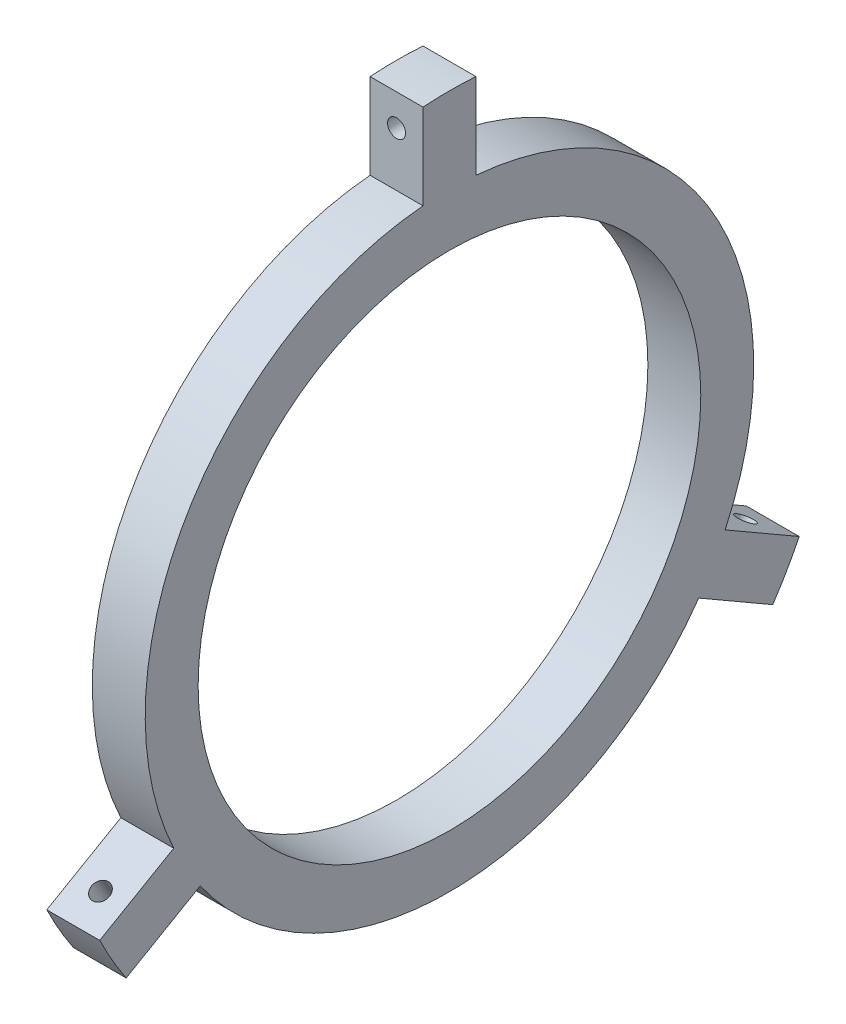
ISO-10303-21;
HEADER;
FILE_DESCRIPTION(('STEP AP214'),'2;1');
FILE_NAME('part.step','',(''),(''),'','','');
FILE_SCHEMA(('AUTOMOTIVE_DESIGN { 1 0 10303 214 1 1 1 1 }'));
ENDSEC;
DATA;
#1=APPLICATION_CONTEXT('core data for automotive mechanical design processes');
#2=APPLICATION_PROTOCOL_DEFINITION('international standard','automotive_design',2000,#1);
#3=PRODUCT_CONTEXT('',#1,'mechanical');
#4=PRODUCT('Part','Part','',(#3));
#5=PRODUCT_RELATED_PRODUCT_CATEGORY('part','',(#4));
#6=PRODUCT_DEFINITION_FORMATION('','',#4);
#7=PRODUCT_DEFINITION_CONTEXT('part definition',#1,'design');
#8=PRODUCT_DEFINITION('design','',#6,#7);
#9=PRODUCT_DEFINITION_SHAPE('','',#8);
#10=(LENGTH_UNIT() NAMED_UNIT(*) SI_UNIT(.MILLI.,.METRE.));
#11=(NAMED_UNIT(*) PLANE_ANGLE_UNIT() SI_UNIT($,.RADIAN.));
#12=(NAMED_UNIT(*) SI_UNIT($,.STERADIAN.) SOLID_ANGLE_UNIT());
#13=UNCERTAINTY_MEASURE_WITH_UNIT(LENGTH_MEASURE(1.E-05),#10,'distance_accuracy_value','');
#14=(GEOMETRIC_REPRESENTATION_CONTEXT(3) GLOBAL_UNCERTAINTY_ASSIGNED_CONTEXT((#13)) GLOBAL_UNIT_ASSIGNED_CONTEXT((#10,
#11,#12)) REPRESENTATION_CONTEXT('',''));
#15=CARTESIAN_POINT('',(0.,0.,0.));
#16=DIRECTION('',(0.,0.,1.));
#17=DIRECTION('',(1.,0.,0.));
#18=AXIS2_PLACEMENT_3D('',#15,#16,#17);
#19=CARTESIAN_POINT('',(-5.00000000000001,73.61,-5.));
#20=DIRECTION('',(-1.,0.,0.));
#21=DIRECTION('',(0.,0.,1.));
#22=AXIS2_PLACEMENT_3D('',#19,#20,#21);
#23=PLANE('',#22);
#24=CARTESIAN_POINT('',(-5.00000000000007,0.,0.));
#25=DIRECTION('',(1.,0.,0.));
#26=DIRECTION('',(0.,0.,-1.));
#27=AXIS2_PLACEMENT_3D('',#24,#25,#26);
#28=CIRCLE('',#27,47.5);
#29=CARTESIAN_POINT('',(-5.00000000000007,0.,-47.5));
#30=VERTEX_POINT('',#29);
#31=EDGE_CURVE('E278',#30,#30,#28,.T.);
#32=ORIENTED_EDGE('',*,*,#31,.T.);
#33=EDGE_LOOP('',(#32));
#34=FACE_BOUND('',#33,.T.);
#35=DIRECTION('',(0.,0.499999999999992,-0.866025403784443));
#36=VECTOR('',#35,1.);
#37=CARTESIAN_POINT('',(-5.00000000000001,-32.4748729810772,66.2481299725728));
#38=LINE('',#37,#36);
#39=CARTESIAN_POINT('',(-5.00000000000007,-32.3898678748677,66.1008968097152));
#40=VERTEX_POINT('',#39);
#41=CARTESIAN_POINT('',(-5.00000000000001,-24.3109710745513,52.1078370824613));
#42=VERTEX_POINT('',#41);
#43=EDGE_CURVE('E165',#40,#42,#38,.T.);
#44=ORIENTED_EDGE('',*,*,#43,.T.);
#45=CARTESIAN_POINT('',(-5.,0.,0.));
#46=DIRECTION('',(-1.,0.,0.));
#47=DIRECTION('',(0.,0.,1.));
#48=AXIS2_PLACEMENT_3D('',#45,#46,#47);
#49=CIRCLE('',#48,57.5);
#50=CARTESIAN_POINT('',(-5.,57.282196186948,5.));
#51=VERTEX_POINT('',#50);
#52=EDGE_CURVE('E127',#51,#42,#49,.F.);
#53=ORIENTED_EDGE('',*,*,#52,.F.);
#54=DIRECTION('',(0.,-1.,0.));
#55=VECTOR('',#54,1.);
#56=CARTESIAN_POINT('',(-5.00000000000001,73.61,5.));
#57=LINE('',#56,#55);
#58=CARTESIAN_POINT('',(-5.00000000000001,73.439989787581,5.));
#59=VERTEX_POINT('',#58);
#60=EDGE_CURVE('E139',#59,#51,#57,.T.);
#61=ORIENTED_EDGE('',*,*,#60,.F.);
#62=CARTESIAN_POINT('',(-5.00000000000001,0.,0.));
#63=DIRECTION('',(-1.,0.,0.));
#64=DIRECTION('',(0.,-1.,0.));
#65=AXIS2_PLACEMENT_3D('',#62,#63,#64);
#66=CIRCLE('',#65,73.61);
#67=CARTESIAN_POINT('',(-5.00000000000003,73.439989787581,-5.));
#68=VERTEX_POINT('',#67);
#69=EDGE_CURVE('E216',#59,#68,#66,.T.);
#70=ORIENTED_EDGE('',*,*,#69,.T.);
#71=DIRECTION('',(0.,-1.,0.));
#72=VECTOR('',#71,1.);
#73=CARTESIAN_POINT('',(-5.00000000000001,73.61,-5.));
#74=LINE('',#73,#72);
#75=CARTESIAN_POINT('',(-5.00000000000001,57.282196186948,-5.));
#76=VERTEX_POINT('',#75);
#77=EDGE_CURVE('E147',#68,#76,#74,.T.);
#78=ORIENTED_EDGE('',*,*,#77,.T.);
#79=CARTESIAN_POINT('',(-5.,-24.3109710745521,-52.107837082461));
#80=VERTEX_POINT('',#79);
#81=EDGE_CURVE('E224',#80,#76,#49,.F.);
#82=ORIENTED_EDGE('',*,*,#81,.F.);
#83=DIRECTION('',(0.,0.500000000000004,0.866025403784436));
#84=VECTOR('',#83,1.);
#85=CARTESIAN_POINT('',(-5.00000000000001,-32.4748729810781,-66.2481299725724));
#86=LINE('',#85,#84);
#87=CARTESIAN_POINT('',(-5.00000000000006,-32.3898678748686,-66.1008968097147));
#88=VERTEX_POINT('',#87);
#89=EDGE_CURVE('E201',#88,#80,#86,.T.);
#90=ORIENTED_EDGE('',*,*,#89,.F.);
#91=CARTESIAN_POINT('',(-5.00000000000005,0.,0.));
#92=DIRECTION('',(-1.,0.,0.));
#93=DIRECTION('',(0.,0.500000000000004,0.866025403784436));
#94=AXIS2_PLACEMENT_3D('',#91,#92,#93);
#95=CIRCLE('',#94,73.61);
#96=CARTESIAN_POINT('',(-5.00000000000006,-41.050121912713,-61.1008968097147));
#97=VERTEX_POINT('',#96);
#98=EDGE_CURVE('E188',#88,#97,#95,.T.);
#99=ORIENTED_EDGE('',*,*,#98,.T.);
#100=DIRECTION('',(0.,0.500000000000004,0.866025403784436));
#101=VECTOR('',#100,1.);
#102=CARTESIAN_POINT('',(-5.00000000000001,-41.1351270189225,-61.2481299725724));
#103=LINE('',#102,#101);
#104=CARTESIAN_POINT('',(-5.00000000000001,-32.9712251123964,-47.1078370824609));
#105=VERTEX_POINT('',#104);
#106=EDGE_CURVE('E205',#97,#105,#103,.T.);
#107=ORIENTED_EDGE('',*,*,#106,.T.);
#108=CARTESIAN_POINT('',(-5.,-32.9712251123958,47.1078370824614));
#109=VERTEX_POINT('',#108);
#110=EDGE_CURVE('E226',#109,#105,#49,.F.);
#111=ORIENTED_EDGE('',*,*,#110,.F.);
#112=DIRECTION('',(0.,0.499999999999992,-0.866025403784443));
#113=VECTOR('',#112,1.);
#114=CARTESIAN_POINT('',(-5.00000000000001,-41.1351270189216,61.2481299725729));
#115=LINE('',#114,#113);
#116=CARTESIAN_POINT('',(-5.00000000000007,-41.0501219127121,61.1008968097153));
#117=VERTEX_POINT('',#116);
#118=EDGE_CURVE('E178',#117,#109,#115,.T.);
#119=ORIENTED_EDGE('',*,*,#118,.F.);
#120=CARTESIAN_POINT('',(-5.00000000000005,0.,0.));
#121=DIRECTION('',(-1.,0.,0.));
#122=DIRECTION('',(0.,0.499999999999992,-0.866025403784443));
#123=AXIS2_PLACEMENT_3D('',#120,#121,#122);
#124=CIRCLE('',#123,73.61);
#125=EDGE_CURVE('E171',#117,#40,#124,.T.);
#126=ORIENTED_EDGE('',*,*,#125,.T.);
#127=EDGE_LOOP('',(#44,#53,#61,#70,#78,#82,#90,#99,#107,#111,#119,#126));
#128=FACE_BOUND('',#127,.T.);
#129=ADVANCED_FACE('F33',(#34,#128),#23,.T.);
#130=CARTESIAN_POINT('',(5.00000000000001,0.,-5.));
#131=DIRECTION('',(1.,0.,0.));
#132=DIRECTION('',(0.,0.,-1.));
#133=AXIS2_PLACEMENT_3D('',#130,#131,#132);
#134=PLANE('',#133);
#135=CARTESIAN_POINT('',(5.00000000000001,0.,0.));
#136=DIRECTION('',(1.,0.,0.));
#137=DIRECTION('',(0.,0.,-1.));
#138=AXIS2_PLACEMENT_3D('',#135,#136,#137);
#139=CIRCLE('',#138,47.5);
#140=CARTESIAN_POINT('',(5.00000000000001,0.,-47.5));
#141=VERTEX_POINT('',#140);
#142=EDGE_CURVE('E280',#141,#141,#139,.T.);
#143=ORIENTED_EDGE('',*,*,#142,.F.);
#144=EDGE_LOOP('',(#143));
#145=FACE_BOUND('',#144,.T.);
#146=DIRECTION('',(0.,-0.500000000000004,-0.866025403784436));
#147=VECTOR('',#146,1.);
#148=CARTESIAN_POINT('',(5.00000000000001,4.33012701892218,-2.50000000000002));
#149=LINE('',#148,#147);
#150=CARTESIAN_POINT('',(5.00000000000001,-24.3109710745521,-52.107837082461));
#151=VERTEX_POINT('',#150);
#152=CARTESIAN_POINT('',(4.99999999999999,-32.3898678748686,-66.1008968097147));
#153=VERTEX_POINT('',#152);
#154=EDGE_CURVE('E203',#151,#153,#149,.T.);
#155=ORIENTED_EDGE('',*,*,#154,.F.);
#156=CARTESIAN_POINT('',(5.00000000000001,0.,0.));
#157=DIRECTION('',(1.,0.,0.));
#158=DIRECTION('',(0.,0.,-1.));
#159=AXIS2_PLACEMENT_3D('',#156,#157,#158);
#160=CIRCLE('',#159,57.5);
#161=CARTESIAN_POINT('',(5.00000000000001,57.282196186948,-5.));
#162=VERTEX_POINT('',#161);
#163=EDGE_CURVE('E130',#151,#162,#160,.T.);
#164=ORIENTED_EDGE('',*,*,#163,.T.);
#165=DIRECTION('',(0.,1.,0.));
#166=VECTOR('',#165,1.);
#167=CARTESIAN_POINT('',(5.00000000000001,0.,-5.));
#168=LINE('',#167,#166);
#169=CARTESIAN_POINT('',(4.99999999999999,73.439989787581,-5.));
#170=VERTEX_POINT('',#169);
#171=EDGE_CURVE('E52',#162,#170,#168,.T.);
#172=ORIENTED_EDGE('',*,*,#171,.T.);
#173=CARTESIAN_POINT('',(5.00000000000001,0.,0.));
#174=DIRECTION('',(-1.,0.,0.));
#175=DIRECTION('',(0.,-1.,0.));
#176=AXIS2_PLACEMENT_3D('',#173,#174,#175);
#177=CIRCLE('',#176,73.61);
#178=CARTESIAN_POINT('',(4.99999999999999,73.439989787581,5.));
#179=VERTEX_POINT('',#178);
#180=EDGE_CURVE('E145',#179,#170,#177,.T.);
#181=ORIENTED_EDGE('',*,*,#180,.F.);
#182=DIRECTION('',(0.,1.,0.));
#183=VECTOR('',#182,1.);
#184=CARTESIAN_POINT('',(5.00000000000001,0.,5.));
#185=LINE('',#184,#183);
#186=CARTESIAN_POINT('',(5.00000000000001,57.282196186948,5.));
#187=VERTEX_POINT('',#186);
#188=EDGE_CURVE('E136',#187,#179,#185,.T.);
#189=ORIENTED_EDGE('',*,*,#188,.F.);
#190=CARTESIAN_POINT('',(5.00000000000001,-24.3109710745513,52.1078370824613));
#191=VERTEX_POINT('',#190);
#192=EDGE_CURVE('E119',#187,#191,#160,.T.);
#193=ORIENTED_EDGE('',*,*,#192,.T.);
#194=DIRECTION('',(0.,-0.499999999999992,0.866025403784443));
#195=VECTOR('',#194,1.);
#196=CARTESIAN_POINT('',(5.00000000000001,4.33012701892222,2.49999999999996));
#197=LINE('',#196,#195);
#198=CARTESIAN_POINT('',(5.00000000000001,-32.3898678748677,66.1008968097152));
#199=VERTEX_POINT('',#198);
#200=EDGE_CURVE('E163',#191,#199,#197,.T.);
#201=ORIENTED_EDGE('',*,*,#200,.T.);
#202=CARTESIAN_POINT('',(5.00000000000001,0.,0.));
#203=DIRECTION('',(-1.,0.,0.));
#204=DIRECTION('',(0.,0.499999999999992,-0.866025403784443));
#205=AXIS2_PLACEMENT_3D('',#202,#203,#204);
#206=CIRCLE('',#205,73.61);
#207=CARTESIAN_POINT('',(4.99999999999999,-41.0501219127121,61.1008968097153));
#208=VERTEX_POINT('',#207);
#209=EDGE_CURVE('E174',#208,#199,#206,.T.);
#210=ORIENTED_EDGE('',*,*,#209,.F.);
#211=DIRECTION('',(0.,-0.499999999999992,0.866025403784443));
#212=VECTOR('',#211,1.);
#213=CARTESIAN_POINT('',(5.00000000000001,-4.33012701892222,-2.49999999999996));
#214=LINE('',#213,#212);
#215=CARTESIAN_POINT('',(5.00000000000001,-32.9712251123958,47.1078370824614));
#216=VERTEX_POINT('',#215);
#217=EDGE_CURVE('E197',#216,#208,#214,.T.);
#218=ORIENTED_EDGE('',*,*,#217,.F.);
#219=CARTESIAN_POINT('',(5.00000000000001,-32.9712251123964,-47.107837082461));
#220=VERTEX_POINT('',#219);
#221=EDGE_CURVE('E128',#216,#220,#160,.T.);
#222=ORIENTED_EDGE('',*,*,#221,.T.);
#223=DIRECTION('',(0.,-0.500000000000004,-0.866025403784436));
#224=VECTOR('',#223,1.);
#225=CARTESIAN_POINT('',(5.00000000000001,-4.33012701892218,2.50000000000002));
#226=LINE('',#225,#224);
#227=CARTESIAN_POINT('',(5.00000000000001,-41.050121912713,-61.1008968097147));
#228=VERTEX_POINT('',#227);
#229=EDGE_CURVE('E208',#220,#228,#226,.T.);
#230=ORIENTED_EDGE('',*,*,#229,.T.);
#231=CARTESIAN_POINT('',(5.00000000000001,0.,0.));
#232=DIRECTION('',(-1.,0.,0.));
#233=DIRECTION('',(0.,0.500000000000004,0.866025403784436));
#234=AXIS2_PLACEMENT_3D('',#231,#232,#233);
#235=CIRCLE('',#234,73.61);
#236=EDGE_CURVE('E181',#153,#228,#235,.T.);
#237=ORIENTED_EDGE('',*,*,#236,.F.);
#238=EDGE_LOOP('',(#155,#164,#172,#181,#189,#193,#201,#210,#218,#222,#230,#237));
#239=FACE_BOUND('',#238,.T.);
#240=ADVANCED_FACE('F143',(#145,#239),#134,.T.);
#241=CARTESIAN_POINT('',(0.,0.,5.));
#242=DIRECTION('',(0.,0.,1.));
#243=DIRECTION('',(1.,0.,0.));
#244=AXIS2_PLACEMENT_3D('',#241,#242,#243);
#245=PLANE('',#244);
#246=DIRECTION('',(1.,0.,0.));
#247=VECTOR('',#246,1.);
#248=CARTESIAN_POINT('',(-167.634559672906,57.282196186948,5.));
#249=LINE('',#248,#247);
#250=EDGE_CURVE('E122',#187,#51,#249,.F.);
#251=ORIENTED_EDGE('',*,*,#250,.F.);
#252=ORIENTED_EDGE('',*,*,#188,.T.);
#253=DIRECTION('',(1.,0.,0.));
#254=VECTOR('',#253,1.);
#255=CARTESIAN_POINT('',(-5.00000000000003,73.439989787581,5.));
#256=LINE('',#255,#254);
#257=EDGE_CURVE('E155',#59,#179,#256,.T.);
#258=ORIENTED_EDGE('',*,*,#257,.F.);
#259=ORIENTED_EDGE('',*,*,#60,.T.);
#260=EDGE_LOOP('',(#251,#252,#258,#259));
#261=FACE_BOUND('',#260,.T.);
#262=CARTESIAN_POINT('',(0.,67.5,4.99999999999999));
#263=DIRECTION('',(0.,0.,-1.));
#264=DIRECTION('',(-1.,0.,0.));
#265=AXIS2_PLACEMENT_3D('',#262,#263,#264);
#266=CIRCLE('',#265,1.69999999999999);
#267=CARTESIAN_POINT('',(-1.70000000000001,67.5,4.99999999999999));
#268=VERTEX_POINT('',#267);
#269=EDGE_CURVE('E213',#268,#268,#266,.T.);
#270=ORIENTED_EDGE('',*,*,#269,.T.);
#271=EDGE_LOOP('',(#270));
#272=FACE_BOUND('',#271,.T.);
#273=ADVANCED_FACE('F133',(#261,#272),#245,.T.);
#274=CARTESIAN_POINT('',(0.,0.,-5.));
#275=DIRECTION('',(0.,0.,1.));
#276=DIRECTION('',(1.,0.,0.));
#277=AXIS2_PLACEMENT_3D('',#274,#275,#276);
#278=PLANE('',#277);
#279=CARTESIAN_POINT('',(0.,67.5,-5.));
#280=DIRECTION('',(0.,0.,-1.));
#281=DIRECTION('',(-1.,0.,0.));
#282=AXIS2_PLACEMENT_3D('',#279,#280,#281);
#283=CIRCLE('',#282,1.69999999999999);
#284=CARTESIAN_POINT('',(-1.70000000000001,67.5,-5.));
#285=VERTEX_POINT('',#284);
#286=EDGE_CURVE('E210',#285,#285,#283,.T.);
#287=ORIENTED_EDGE('',*,*,#286,.F.);
#288=EDGE_LOOP('',(#287));
#289=FACE_BOUND('',#288,.T.);
#290=ORIENTED_EDGE('',*,*,#171,.F.);
#291=DIRECTION('',(1.,0.,0.));
#292=VECTOR('',#291,1.);
#293=CARTESIAN_POINT('',(-167.634559672906,57.282196186948,-5.));
#294=LINE('',#293,#292);
#295=EDGE_CURVE('E47',#162,#76,#294,.F.);
#296=ORIENTED_EDGE('',*,*,#295,.T.);
#297=ORIENTED_EDGE('',*,*,#77,.F.);
#298=DIRECTION('',(1.,0.,0.));
#299=VECTOR('',#298,1.);
#300=CARTESIAN_POINT('',(-5.00000000000003,73.439989787581,-5.));
#301=LINE('',#300,#299);
#302=EDGE_CURVE('E150',#68,#170,#301,.T.);
#303=ORIENTED_EDGE('',*,*,#302,.T.);
#304=EDGE_LOOP('',(#290,#296,#297,#303));
#305=FACE_BOUND('',#304,.T.);
#306=ADVANCED_FACE('F219',(#289,#305),#278,.F.);
#307=CARTESIAN_POINT('',(-5.00000000000001,0.,0.));
#308=DIRECTION('',(1.,0.,0.));
#309=DIRECTION('',(0.,1.,0.));
#310=AXIS2_PLACEMENT_3D('',#307,#308,#309);
#311=CYLINDRICAL_SURFACE('',#310,73.61);
#312=ORIENTED_EDGE('',*,*,#180,.T.);
#313=ORIENTED_EDGE('',*,*,#302,.F.);
#314=ORIENTED_EDGE('',*,*,#69,.F.);
#315=ORIENTED_EDGE('',*,*,#257,.T.);
#316=EDGE_LOOP('',(#312,#313,#314,#315));
#317=FACE_BOUND('',#316,.T.);
#318=ADVANCED_FACE('F221',(#317),#311,.T.);
#319=CARTESIAN_POINT('',(0.,67.5,-5.));
#320=DIRECTION('',(0.,0.,-1.));
#321=DIRECTION('',(-1.,0.,0.));
#322=AXIS2_PLACEMENT_3D('',#319,#320,#321);
#323=CYLINDRICAL_SURFACE('',#322,1.69999999999999);
#324=ORIENTED_EDGE('',*,*,#269,.F.);
#325=EDGE_LOOP('',(#324));
#326=FACE_BOUND('',#325,.T.);
#327=ORIENTED_EDGE('',*,*,#286,.T.);
#328=EDGE_LOOP('',(#327));
#329=FACE_BOUND('',#328,.T.);
#330=ADVANCED_FACE('F257',(#326,#329),#323,.F.);
#331=CARTESIAN_POINT('',(0.,4.33012701892218,-2.50000000000002));
#332=DIRECTION('',(0.,0.866025403784436,-0.500000000000004));
#333=DIRECTION('',(1.,0.,0.));
#334=AXIS2_PLACEMENT_3D('',#331,#332,#333);
#335=PLANE('',#334);
#336=DIRECTION('',(1.,0.,0.));
#337=VECTOR('',#336,1.);
#338=CARTESIAN_POINT('',(-167.634559672906,-24.3109710745521,-52.107837082461));
#339=LINE('',#338,#337);
#340=EDGE_CURVE('E235',#151,#80,#339,.F.);
#341=ORIENTED_EDGE('',*,*,#340,.F.);
#342=ORIENTED_EDGE('',*,*,#154,.T.);
#343=DIRECTION('',(1.,0.,0.));
#344=VECTOR('',#343,1.);
#345=CARTESIAN_POINT('',(-5.00000000000006,-32.3898678748686,-66.1008968097147));
#346=LINE('',#345,#344);
#347=EDGE_CURVE('E191',#88,#153,#346,.T.);
#348=ORIENTED_EDGE('',*,*,#347,.F.);
#349=ORIENTED_EDGE('',*,*,#89,.T.);
#350=EDGE_LOOP('',(#341,#342,#348,#349));
#351=FACE_BOUND('',#350,.T.);
#352=CARTESIAN_POINT('',(0.,-29.4198729810781,-60.9567147554495));
#353=DIRECTION('',(0.,0.866025403784436,-0.500000000000004));
#354=DIRECTION('',(0.,0.500000000000004,0.866025403784436));
#355=AXIS2_PLACEMENT_3D('',#352,#353,#354);
#356=CIRCLE('',#355,1.69999999999999);
#357=CARTESIAN_POINT('',(0.,-28.5698729810781,-59.484471569016));
#358=VERTEX_POINT('',#357);
#359=EDGE_CURVE('E183',#358,#358,#356,.T.);
#360=ORIENTED_EDGE('',*,*,#359,.F.);
#361=EDGE_LOOP('',(#360));
#362=FACE_BOUND('',#361,.T.);
#363=ADVANCED_FACE('F254',(#351,#362),#335,.T.);
#364=CARTESIAN_POINT('',(0.,-4.33012701892218,2.50000000000002));
#365=DIRECTION('',(0.,0.866025403784436,-0.500000000000004));
#366=DIRECTION('',(1.,0.,0.));
#367=AXIS2_PLACEMENT_3D('',#364,#365,#366);
#368=PLANE('',#367);
#369=CARTESIAN_POINT('',(0.,-38.0801270189225,-55.9567147554494));
#370=DIRECTION('',(0.,-0.866025403784436,0.500000000000004));
#371=DIRECTION('',(0.,-0.500000000000004,-0.866025403784436));
#372=AXIS2_PLACEMENT_3D('',#369,#370,#371);
#373=CIRCLE('',#372,1.69999999999999);
#374=CARTESIAN_POINT('',(0.,-38.9301270189225,-57.428957941883));
#375=VERTEX_POINT('',#374);
#376=EDGE_CURVE('E245',#375,#375,#373,.T.);
#377=ORIENTED_EDGE('',*,*,#376,.F.);
#378=EDGE_LOOP('',(#377));
#379=FACE_BOUND('',#378,.T.);
#380=ORIENTED_EDGE('',*,*,#229,.F.);
#381=DIRECTION('',(1.,0.,0.));
#382=VECTOR('',#381,1.);
#383=CARTESIAN_POINT('',(-167.634559672906,-32.9712251123964,-47.1078370824609));
#384=LINE('',#383,#382);
#385=EDGE_CURVE('E233',#220,#105,#384,.F.);
#386=ORIENTED_EDGE('',*,*,#385,.T.);
#387=ORIENTED_EDGE('',*,*,#106,.F.);
#388=DIRECTION('',(1.,0.,0.));
#389=VECTOR('',#388,1.);
#390=CARTESIAN_POINT('',(-5.00000000000006,-41.050121912713,-61.1008968097147));
#391=LINE('',#390,#389);
#392=EDGE_CURVE('E157',#97,#228,#391,.T.);
#393=ORIENTED_EDGE('',*,*,#392,.T.);
#394=EDGE_LOOP('',(#380,#386,#387,#393));
#395=FACE_BOUND('',#394,.T.);
#396=ADVANCED_FACE('F256',(#379,#395),#368,.F.);
#397=CARTESIAN_POINT('',(0.,-4.33012701892222,-2.49999999999996));
#398=DIRECTION('',(0.,-0.866025403784443,-0.499999999999992));
#399=DIRECTION('',(1.,0.,0.));
#400=AXIS2_PLACEMENT_3D('',#397,#398,#399);
#401=PLANE('',#400);
#402=DIRECTION('',(1.,0.,0.));
#403=VECTOR('',#402,1.);
#404=CARTESIAN_POINT('',(-167.634559672906,-32.9712251123958,47.1078370824614));
#405=LINE('',#404,#403);
#406=EDGE_CURVE('E229',#216,#109,#405,.F.);
#407=ORIENTED_EDGE('',*,*,#406,.F.);
#408=ORIENTED_EDGE('',*,*,#217,.T.);
#409=DIRECTION('',(1.,0.,0.));
#410=VECTOR('',#409,1.);
#411=CARTESIAN_POINT('',(-5.00000000000007,-41.0501219127121,61.1008968097153));
#412=LINE('',#411,#410);
#413=EDGE_CURVE('E179',#117,#208,#412,.T.);
#414=ORIENTED_EDGE('',*,*,#413,.F.);
#415=ORIENTED_EDGE('',*,*,#118,.T.);
#416=EDGE_LOOP('',(#407,#408,#414,#415));
#417=FACE_BOUND('',#416,.T.);
#418=CARTESIAN_POINT('',(0.,-38.0801270189217,55.95671475545));
#419=DIRECTION('',(0.,-0.866025403784443,-0.499999999999992));
#420=DIRECTION('',(0.,0.499999999999992,-0.866025403784443));
#421=AXIS2_PLACEMENT_3D('',#418,#419,#420);
#422=CIRCLE('',#421,1.69999999999998);
#423=CARTESIAN_POINT('',(0.,-37.2301270189217,54.4844715690164));
#424=VERTEX_POINT('',#423);
#425=EDGE_CURVE('E243',#424,#424,#422,.T.);
#426=ORIENTED_EDGE('',*,*,#425,.F.);
#427=EDGE_LOOP('',(#426));
#428=FACE_BOUND('',#427,.T.);
#429=ADVANCED_FACE('F264',(#417,#428),#401,.T.);
#430=CARTESIAN_POINT('',(0.,4.33012701892222,2.49999999999996));
#431=DIRECTION('',(0.,-0.866025403784443,-0.499999999999992));
#432=DIRECTION('',(1.,0.,0.));
#433=AXIS2_PLACEMENT_3D('',#430,#431,#432);
#434=PLANE('',#433);
#435=CARTESIAN_POINT('',(0.,-29.4198729810772,60.9567147554499));
#436=DIRECTION('',(0.,0.866025403784443,0.499999999999992));
#437=DIRECTION('',(0.,-0.499999999999992,0.866025403784443));
#438=AXIS2_PLACEMENT_3D('',#435,#436,#437);
#439=CIRCLE('',#438,1.69999999999999);
#440=CARTESIAN_POINT('',(0.,-30.2698729810772,62.4289579418834));
#441=VERTEX_POINT('',#440);
#442=EDGE_CURVE('E140',#441,#441,#439,.T.);
#443=ORIENTED_EDGE('',*,*,#442,.F.);
#444=EDGE_LOOP('',(#443));
#445=FACE_BOUND('',#444,.T.);
#446=ORIENTED_EDGE('',*,*,#200,.F.);
#447=DIRECTION('',(1.,0.,0.));
#448=VECTOR('',#447,1.);
#449=CARTESIAN_POINT('',(-167.634559672906,-24.3109710745513,52.1078370824613));
#450=LINE('',#449,#448);
#451=EDGE_CURVE('E11',#191,#42,#450,.F.);
#452=ORIENTED_EDGE('',*,*,#451,.T.);
#453=ORIENTED_EDGE('',*,*,#43,.F.);
#454=DIRECTION('',(1.,0.,0.));
#455=VECTOR('',#454,1.);
#456=CARTESIAN_POINT('',(-5.00000000000007,-32.3898678748677,66.1008968097152));
#457=LINE('',#456,#455);
#458=EDGE_CURVE('E40',#40,#199,#457,.T.);
#459=ORIENTED_EDGE('',*,*,#458,.T.);
#460=EDGE_LOOP('',(#446,#452,#453,#459));
#461=FACE_BOUND('',#460,.T.);
#462=ADVANCED_FACE('F162',(#445,#461),#434,.F.);
#463=CARTESIAN_POINT('',(-5.00000000000005,0.,0.));
#464=DIRECTION('',(1.,0.,0.));
#465=DIRECTION('',(0.,0.,-1.));
#466=AXIS2_PLACEMENT_3D('',#463,#464,#465);
#467=CYLINDRICAL_SURFACE('',#466,73.61);
#468=ORIENTED_EDGE('',*,*,#236,.T.);
#469=ORIENTED_EDGE('',*,*,#392,.F.);
#470=ORIENTED_EDGE('',*,*,#98,.F.);
#471=ORIENTED_EDGE('',*,*,#347,.T.);
#472=EDGE_LOOP('',(#468,#469,#470,#471));
#473=FACE_BOUND('',#472,.T.);
#474=ADVANCED_FACE('F307',(#473),#467,.T.);
#475=CARTESIAN_POINT('',(-5.00000000000005,0.,0.));
#476=DIRECTION('',(1.,0.,0.));
#477=DIRECTION('',(0.,0.,-1.));
#478=AXIS2_PLACEMENT_3D('',#475,#476,#477);
#479=CYLINDRICAL_SURFACE('',#478,73.61);
#480=ORIENTED_EDGE('',*,*,#209,.T.);
#481=ORIENTED_EDGE('',*,*,#458,.F.);
#482=ORIENTED_EDGE('',*,*,#125,.F.);
#483=ORIENTED_EDGE('',*,*,#413,.T.);
#484=EDGE_LOOP('',(#480,#481,#482,#483));
#485=FACE_BOUND('',#484,.T.);
#486=ADVANCED_FACE('F169',(#485),#479,.T.);
#487=CARTESIAN_POINT('',(0.,-38.0801270189225,-55.9567147554494));
#488=DIRECTION('',(0.,-0.866025403784436,0.500000000000004));
#489=DIRECTION('',(0.,-0.500000000000004,-0.866025403784436));
#490=AXIS2_PLACEMENT_3D('',#487,#488,#489);
#491=CYLINDRICAL_SURFACE('',#490,1.69999999999999);
#492=ORIENTED_EDGE('',*,*,#359,.T.);
#493=EDGE_LOOP('',(#492));
#494=FACE_BOUND('',#493,.T.);
#495=ORIENTED_EDGE('',*,*,#376,.T.);
#496=EDGE_LOOP('',(#495));
#497=FACE_BOUND('',#496,.T.);
#498=ADVANCED_FACE('F252',(#494,#497),#491,.F.);
#499=CARTESIAN_POINT('',(0.,-29.4198729810772,60.9567147554499));
#500=DIRECTION('',(0.,0.866025403784443,0.499999999999992));
#501=DIRECTION('',(0.,-0.499999999999992,0.866025403784443));
#502=AXIS2_PLACEMENT_3D('',#499,#500,#501);
#503=CYLINDRICAL_SURFACE('',#502,1.69999999999998);
#504=ORIENTED_EDGE('',*,*,#425,.T.);
#505=EDGE_LOOP('',(#504));
#506=FACE_BOUND('',#505,.T.);
#507=ORIENTED_EDGE('',*,*,#442,.T.);
#508=EDGE_LOOP('',(#507));
#509=FACE_BOUND('',#508,.T.);
#510=ADVANCED_FACE('F299',(#506,#509),#503,.F.);
#511=CARTESIAN_POINT('',(-167.634559672906,0.,0.));
#512=DIRECTION('',(1.,0.,0.));
#513=DIRECTION('',(0.,0.,-1.));
#514=AXIS2_PLACEMENT_3D('',#511,#512,#513);
#515=CYLINDRICAL_SURFACE('',#514,57.5);
#516=ORIENTED_EDGE('',*,*,#192,.F.);
#517=ORIENTED_EDGE('',*,*,#250,.T.);
#518=ORIENTED_EDGE('',*,*,#52,.T.);
#519=ORIENTED_EDGE('',*,*,#451,.F.);
#520=EDGE_LOOP('',(#516,#517,#518,#519));
#521=FACE_BOUND('',#520,.T.);
#522=ADVANCED_FACE('F121',(#521),#515,.T.);
#523=ORIENTED_EDGE('',*,*,#385,.F.);
#524=ORIENTED_EDGE('',*,*,#221,.F.);
#525=ORIENTED_EDGE('',*,*,#406,.T.);
#526=ORIENTED_EDGE('',*,*,#110,.T.);
#527=EDGE_LOOP('',(#523,#524,#525,#526));
#528=FACE_BOUND('',#527,.T.);
#529=ADVANCED_FACE('F294',(#528),#515,.T.);
#530=ORIENTED_EDGE('',*,*,#295,.F.);
#531=ORIENTED_EDGE('',*,*,#163,.F.);
#532=ORIENTED_EDGE('',*,*,#340,.T.);
#533=ORIENTED_EDGE('',*,*,#81,.T.);
#534=EDGE_LOOP('',(#530,#531,#532,#533));
#535=FACE_BOUND('',#534,.T.);
#536=ADVANCED_FACE('F289',(#535),#515,.T.);
#537=CARTESIAN_POINT('',(-5.00000000000007,0.,0.));
#538=DIRECTION('',(1.,0.,0.));
#539=DIRECTION('',(0.,0.,-1.));
#540=AXIS2_PLACEMENT_3D('',#537,#538,#539);
#541=CYLINDRICAL_SURFACE('',#540,47.5);
#542=ORIENTED_EDGE('',*,*,#31,.F.);
#543=EDGE_LOOP('',(#542));
#544=FACE_BOUND('',#543,.T.);
#545=ORIENTED_EDGE('',*,*,#142,.T.);
#546=EDGE_LOOP('',(#545));
#547=FACE_BOUND('',#546,.T.);
#548=ADVANCED_FACE('F287',(#544,#547),#541,.F.);
#549=CLOSED_SHELL('',(#129,#240,#273,#306,#318,#330,#363,#396,#429,#462,#474,#486,#498,#510,
#522,#529,#536,#548));
#550=MANIFOLD_SOLID_BREP('B2',#549);
#551=ADVANCED_BREP_SHAPE_REPRESENTATION('',(#18,#550),#14);
#552=SHAPE_DEFINITION_REPRESENTATION(#9,#551);
ENDSEC;
END-ISO-10303-21;
